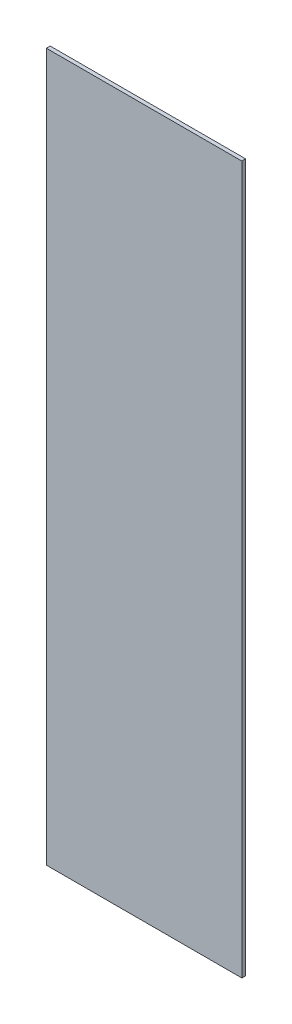
ISO-10303-21;
HEADER;
FILE_DESCRIPTION(('STEP AP214'),'2;1');
FILE_NAME('part.step','',(''),(''),'','','');
FILE_SCHEMA(('AUTOMOTIVE_DESIGN { 1 0 10303 214 1 1 1 1 }'));
ENDSEC;
DATA;
#1=APPLICATION_CONTEXT('core data for automotive mechanical design processes');
#2=APPLICATION_PROTOCOL_DEFINITION('international standard','automotive_design',2000,#1);
#3=PRODUCT_CONTEXT('',#1,'mechanical');
#4=PRODUCT('Part','Part','',(#3));
#5=PRODUCT_RELATED_PRODUCT_CATEGORY('part','',(#4));
#6=PRODUCT_DEFINITION_FORMATION('','',#4);
#7=PRODUCT_DEFINITION_CONTEXT('part definition',#1,'design');
#8=PRODUCT_DEFINITION('design','',#6,#7);
#9=PRODUCT_DEFINITION_SHAPE('','',#8);
#10=(LENGTH_UNIT() NAMED_UNIT(*) SI_UNIT(.MILLI.,.METRE.));
#11=(NAMED_UNIT(*) PLANE_ANGLE_UNIT() SI_UNIT($,.RADIAN.));
#12=(NAMED_UNIT(*) SI_UNIT($,.STERADIAN.) SOLID_ANGLE_UNIT());
#13=UNCERTAINTY_MEASURE_WITH_UNIT(LENGTH_MEASURE(1.E-05),#10,'distance_accuracy_value','');
#14=(GEOMETRIC_REPRESENTATION_CONTEXT(3) GLOBAL_UNCERTAINTY_ASSIGNED_CONTEXT((#13)) GLOBAL_UNIT_ASSIGNED_CONTEXT((#10,
#11,#12)) REPRESENTATION_CONTEXT('',''));
#15=CARTESIAN_POINT('',(0.,0.,0.));
#16=DIRECTION('',(0.,0.,1.));
#17=DIRECTION('',(1.,0.,0.));
#18=AXIS2_PLACEMENT_3D('',#15,#16,#17);
#19=CARTESIAN_POINT('',(0.,0.,1.5875));
#20=DIRECTION('',(1.,0.,0.));
#21=DIRECTION('',(0.,0.,-1.));
#22=AXIS2_PLACEMENT_3D('',#19,#20,#21);
#23=PLANE('',#22);
#24=DIRECTION('',(0.,-1.,0.));
#25=VECTOR('',#24,1.);
#26=CARTESIAN_POINT('',(0.,0.,0.));
#27=LINE('',#26,#25);
#28=CARTESIAN_POINT('',(0.,294.64,0.));
#29=VERTEX_POINT('',#28);
#30=CARTESIAN_POINT('',(0.,0.,0.));
#31=VERTEX_POINT('',#30);
#32=EDGE_CURVE('E107',#29,#31,#27,.T.);
#33=ORIENTED_EDGE('',*,*,#32,.T.);
#34=DIRECTION('',(0.,0.,-1.));
#35=VECTOR('',#34,1.);
#36=CARTESIAN_POINT('',(0.,0.,1.5875));
#37=LINE('',#36,#35);
#38=CARTESIAN_POINT('',(0.,0.,1.5875));
#39=VERTEX_POINT('',#38);
#40=EDGE_CURVE('E11',#39,#31,#37,.T.);
#41=ORIENTED_EDGE('',*,*,#40,.F.);
#42=DIRECTION('',(0.,-1.,0.));
#43=VECTOR('',#42,1.);
#44=CARTESIAN_POINT('',(0.,0.,1.5875));
#45=LINE('',#44,#43);
#46=CARTESIAN_POINT('',(0.,294.64,1.5875));
#47=VERTEX_POINT('',#46);
#48=EDGE_CURVE('E91',#47,#39,#45,.T.);
#49=ORIENTED_EDGE('',*,*,#48,.F.);
#50=DIRECTION('',(0.,0.,-1.));
#51=VECTOR('',#50,1.);
#52=CARTESIAN_POINT('',(0.,294.64,1.5875));
#53=LINE('',#52,#51);
#54=EDGE_CURVE('E103',#47,#29,#53,.T.);
#55=ORIENTED_EDGE('',*,*,#54,.T.);
#56=EDGE_LOOP('',(#33,#41,#49,#55));
#57=FACE_BOUND('',#56,.T.);
#58=ADVANCED_FACE('F39',(#57),#23,.F.);
#59=CARTESIAN_POINT('',(0.,0.,1.5875));
#60=DIRECTION('',(0.,1.,0.));
#61=DIRECTION('',(0.,0.,1.));
#62=AXIS2_PLACEMENT_3D('',#59,#60,#61);
#63=PLANE('',#62);
#64=DIRECTION('',(1.,0.,0.));
#65=VECTOR('',#64,1.);
#66=CARTESIAN_POINT('',(0.,0.,0.));
#67=LINE('',#66,#65);
#68=CARTESIAN_POINT('',(81.4,0.,0.));
#69=VERTEX_POINT('',#68);
#70=EDGE_CURVE('E96',#31,#69,#67,.T.);
#71=ORIENTED_EDGE('',*,*,#70,.T.);
#72=DIRECTION('',(0.,0.,-1.));
#73=VECTOR('',#72,1.);
#74=CARTESIAN_POINT('',(81.4,0.,1.5875));
#75=LINE('',#74,#73);
#76=CARTESIAN_POINT('',(81.4,0.,1.5875));
#77=VERTEX_POINT('',#76);
#78=EDGE_CURVE('E48',#77,#69,#75,.T.);
#79=ORIENTED_EDGE('',*,*,#78,.F.);
#80=DIRECTION('',(1.,0.,0.));
#81=VECTOR('',#80,1.);
#82=CARTESIAN_POINT('',(0.,0.,1.5875));
#83=LINE('',#82,#81);
#84=EDGE_CURVE('E86',#39,#77,#83,.T.);
#85=ORIENTED_EDGE('',*,*,#84,.F.);
#86=ORIENTED_EDGE('',*,*,#40,.T.);
#87=EDGE_LOOP('',(#71,#79,#85,#86));
#88=FACE_BOUND('',#87,.T.);
#89=ADVANCED_FACE('F95',(#88),#63,.F.);
#90=CARTESIAN_POINT('',(81.4,0.,1.5875));
#91=DIRECTION('',(-1.,0.,0.));
#92=DIRECTION('',(0.,0.,1.));
#93=AXIS2_PLACEMENT_3D('',#90,#91,#92);
#94=PLANE('',#93);
#95=DIRECTION('',(0.,1.,0.));
#96=VECTOR('',#95,1.);
#97=CARTESIAN_POINT('',(81.4,0.,0.));
#98=LINE('',#97,#96);
#99=CARTESIAN_POINT('',(81.4,294.64,0.));
#100=VERTEX_POINT('',#99);
#101=EDGE_CURVE('E73',#69,#100,#98,.T.);
#102=ORIENTED_EDGE('',*,*,#101,.T.);
#103=DIRECTION('',(0.,0.,-1.));
#104=VECTOR('',#103,1.);
#105=CARTESIAN_POINT('',(81.4,294.64,1.5875));
#106=LINE('',#105,#104);
#107=CARTESIAN_POINT('',(81.4,294.64,1.5875));
#108=VERTEX_POINT('',#107);
#109=EDGE_CURVE('E98',#108,#100,#106,.T.);
#110=ORIENTED_EDGE('',*,*,#109,.F.);
#111=DIRECTION('',(0.,1.,0.));
#112=VECTOR('',#111,1.);
#113=CARTESIAN_POINT('',(81.4,0.,1.5875));
#114=LINE('',#113,#112);
#115=EDGE_CURVE('E89',#77,#108,#114,.T.);
#116=ORIENTED_EDGE('',*,*,#115,.F.);
#117=ORIENTED_EDGE('',*,*,#78,.T.);
#118=EDGE_LOOP('',(#102,#110,#116,#117));
#119=FACE_BOUND('',#118,.T.);
#120=ADVANCED_FACE('F99',(#119),#94,.F.);
#121=CARTESIAN_POINT('',(0.,294.64,1.5875));
#122=DIRECTION('',(0.,-1.,0.));
#123=DIRECTION('',(0.,0.,-1.));
#124=AXIS2_PLACEMENT_3D('',#121,#122,#123);
#125=PLANE('',#124);
#126=DIRECTION('',(-1.,0.,0.));
#127=VECTOR('',#126,1.);
#128=CARTESIAN_POINT('',(0.,294.64,0.));
#129=LINE('',#128,#127);
#130=EDGE_CURVE('E79',#100,#29,#129,.T.);
#131=ORIENTED_EDGE('',*,*,#130,.T.);
#132=ORIENTED_EDGE('',*,*,#54,.F.);
#133=DIRECTION('',(-1.,0.,0.));
#134=VECTOR('',#133,1.);
#135=CARTESIAN_POINT('',(0.,294.64,1.5875));
#136=LINE('',#135,#134);
#137=EDGE_CURVE('E56',#108,#47,#136,.T.);
#138=ORIENTED_EDGE('',*,*,#137,.F.);
#139=ORIENTED_EDGE('',*,*,#109,.T.);
#140=EDGE_LOOP('',(#131,#132,#138,#139));
#141=FACE_BOUND('',#140,.T.);
#142=ADVANCED_FACE('F120',(#141),#125,.F.);
#143=CARTESIAN_POINT('',(0.,0.,1.5875));
#144=DIRECTION('',(0.,0.,-1.));
#145=DIRECTION('',(-1.,0.,0.));
#146=AXIS2_PLACEMENT_3D('',#143,#144,#145);
#147=PLANE('',#146);
#148=ORIENTED_EDGE('',*,*,#48,.T.);
#149=ORIENTED_EDGE('',*,*,#84,.T.);
#150=ORIENTED_EDGE('',*,*,#115,.T.);
#151=ORIENTED_EDGE('',*,*,#137,.T.);
#152=EDGE_LOOP('',(#148,#149,#150,#151));
#153=FACE_BOUND('',#152,.T.);
#154=ADVANCED_FACE('F87',(#153),#147,.F.);
#155=CARTESIAN_POINT('',(0.,0.,0.));
#156=DIRECTION('',(0.,0.,-1.));
#157=DIRECTION('',(-1.,0.,0.));
#158=AXIS2_PLACEMENT_3D('',#155,#156,#157);
#159=PLANE('',#158);
#160=ORIENTED_EDGE('',*,*,#32,.F.);
#161=ORIENTED_EDGE('',*,*,#130,.F.);
#162=ORIENTED_EDGE('',*,*,#101,.F.);
#163=ORIENTED_EDGE('',*,*,#70,.F.);
#164=EDGE_LOOP('',(#160,#161,#162,#163));
#165=FACE_BOUND('',#164,.T.);
#166=ADVANCED_FACE('F123',(#165),#159,.T.);
#167=CLOSED_SHELL('',(#58,#89,#120,#142,#154,#166));
#168=MANIFOLD_SOLID_BREP('B2',#167);
#169=ADVANCED_BREP_SHAPE_REPRESENTATION('',(#18,#168),#14);
#170=SHAPE_DEFINITION_REPRESENTATION(#9,#169);
ENDSEC;
END-ISO-10303-21;
